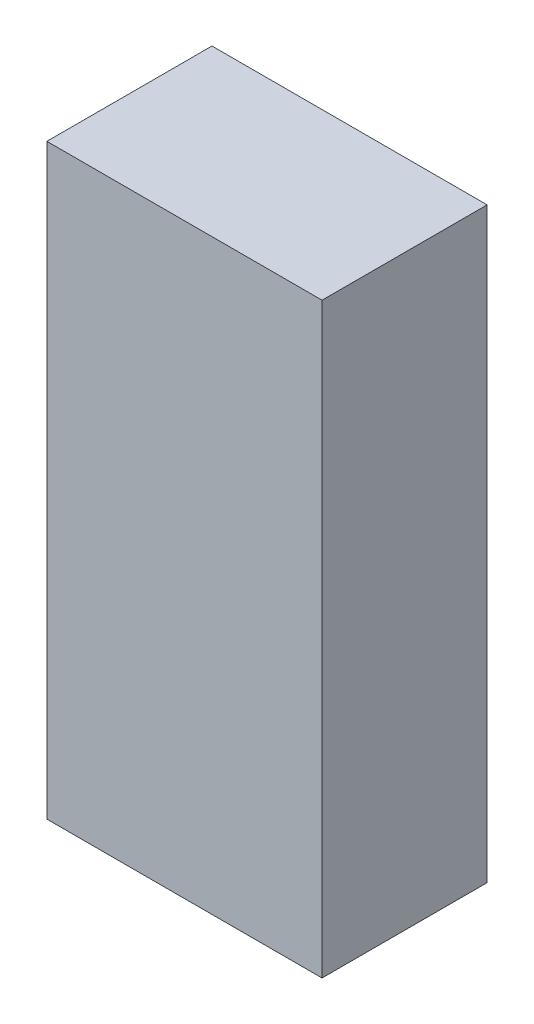
ISO-10303-21;
HEADER;
FILE_DESCRIPTION(('STEP AP214'),'2;1');
FILE_NAME('part.step','',(''),(''),'','','');
FILE_SCHEMA(('AUTOMOTIVE_DESIGN { 1 0 10303 214 1 1 1 1 }'));
ENDSEC;
DATA;
#1=APPLICATION_CONTEXT('core data for automotive mechanical design processes');
#2=APPLICATION_PROTOCOL_DEFINITION('international standard','automotive_design',2000,#1);
#3=PRODUCT_CONTEXT('',#1,'mechanical');
#4=PRODUCT('Part','Part','',(#3));
#5=PRODUCT_RELATED_PRODUCT_CATEGORY('part','',(#4));
#6=PRODUCT_DEFINITION_FORMATION('','',#4);
#7=PRODUCT_DEFINITION_CONTEXT('part definition',#1,'design');
#8=PRODUCT_DEFINITION('design','',#6,#7);
#9=PRODUCT_DEFINITION_SHAPE('','',#8);
#10=(LENGTH_UNIT() NAMED_UNIT(*) SI_UNIT(.MILLI.,.METRE.));
#11=(NAMED_UNIT(*) PLANE_ANGLE_UNIT() SI_UNIT($,.RADIAN.));
#12=(NAMED_UNIT(*) SI_UNIT($,.STERADIAN.) SOLID_ANGLE_UNIT());
#13=UNCERTAINTY_MEASURE_WITH_UNIT(LENGTH_MEASURE(1.E-05),#10,'distance_accuracy_value','');
#14=(GEOMETRIC_REPRESENTATION_CONTEXT(3) GLOBAL_UNCERTAINTY_ASSIGNED_CONTEXT((#13)) GLOBAL_UNIT_ASSIGNED_CONTEXT((#10,
#11,#12)) REPRESENTATION_CONTEXT('',''));
#15=CARTESIAN_POINT('',(0.,0.,0.));
#16=DIRECTION('',(0.,0.,1.));
#17=DIRECTION('',(1.,0.,0.));
#18=AXIS2_PLACEMENT_3D('',#15,#16,#17);
#19=CARTESIAN_POINT('',(0.75000104,1.59999934,0.90000074));
#20=DIRECTION('',(0.,0.,1.));
#21=DIRECTION('',(1.,0.,0.));
#22=AXIS2_PLACEMENT_3D('',#19,#20,#21);
#23=PLANE('',#22);
#24=DIRECTION('',(1.,0.,0.));
#25=VECTOR('',#24,1.);
#26=CARTESIAN_POINT('',(0.75000104,-1.59999934,0.90000074));
#27=LINE('',#26,#25);
#28=CARTESIAN_POINT('',(0.75000104,-1.59999934,0.90000074));
#29=VERTEX_POINT('',#28);
#30=CARTESIAN_POINT('',(-0.75000104,-1.59999934,0.90000074));
#31=VERTEX_POINT('',#30);
#32=EDGE_CURVE('E53',#29,#31,#27,.F.);
#33=ORIENTED_EDGE('',*,*,#32,.F.);
#34=DIRECTION('',(0.,1.,0.));
#35=VECTOR('',#34,1.);
#36=CARTESIAN_POINT('',(0.75000104,1.59999934,0.90000074));
#37=LINE('',#36,#35);
#38=CARTESIAN_POINT('',(0.75000104,1.59999934,0.90000074));
#39=VERTEX_POINT('',#38);
#40=EDGE_CURVE('E68',#39,#29,#37,.F.);
#41=ORIENTED_EDGE('',*,*,#40,.F.);
#42=DIRECTION('',(1.,0.,0.));
#43=VECTOR('',#42,1.);
#44=CARTESIAN_POINT('',(-0.75000104,1.59999934,0.90000074));
#45=LINE('',#44,#43);
#46=CARTESIAN_POINT('',(-0.75000104,1.59999934,0.90000074));
#47=VERTEX_POINT('',#46);
#48=EDGE_CURVE('E20',#47,#39,#45,.T.);
#49=ORIENTED_EDGE('',*,*,#48,.F.);
#50=DIRECTION('',(0.,1.,0.));
#51=VECTOR('',#50,1.);
#52=CARTESIAN_POINT('',(-0.75000104,-1.59999934,0.90000074));
#53=LINE('',#52,#51);
#54=EDGE_CURVE('E58',#31,#47,#53,.T.);
#55=ORIENTED_EDGE('',*,*,#54,.F.);
#56=EDGE_LOOP('',(#33,#41,#49,#55));
#57=FACE_BOUND('',#56,.T.);
#58=ADVANCED_FACE('F17',(#57),#23,.T.);
#59=CARTESIAN_POINT('',(-0.75000104,1.59999934,0.));
#60=DIRECTION('',(0.,1.,0.));
#61=DIRECTION('',(0.,0.,1.));
#62=AXIS2_PLACEMENT_3D('',#59,#60,#61);
#63=PLANE('',#62);
#64=DIRECTION('',(0.,0.,-1.));
#65=VECTOR('',#64,1.);
#66=CARTESIAN_POINT('',(0.75000104,1.59999934,0.));
#67=LINE('',#66,#65);
#68=CARTESIAN_POINT('',(0.75000104,1.59999934,0.));
#69=VERTEX_POINT('',#68);
#70=EDGE_CURVE('E79',#69,#39,#67,.F.);
#71=ORIENTED_EDGE('',*,*,#70,.F.);
#72=DIRECTION('',(1.,0.,0.));
#73=VECTOR('',#72,1.);
#74=CARTESIAN_POINT('',(0.75000104,1.59999934,0.));
#75=LINE('',#74,#73);
#76=CARTESIAN_POINT('',(-0.75000104,1.59999934,0.));
#77=VERTEX_POINT('',#76);
#78=EDGE_CURVE('E74',#69,#77,#75,.F.);
#79=ORIENTED_EDGE('',*,*,#78,.T.);
#80=DIRECTION('',(0.,0.,1.));
#81=VECTOR('',#80,1.);
#82=CARTESIAN_POINT('',(-0.75000104,1.59999934,0.));
#83=LINE('',#82,#81);
#84=EDGE_CURVE('E63',#47,#77,#83,.F.);
#85=ORIENTED_EDGE('',*,*,#84,.F.);
#86=ORIENTED_EDGE('',*,*,#48,.T.);
#87=EDGE_LOOP('',(#71,#79,#85,#86));
#88=FACE_BOUND('',#87,.T.);
#89=ADVANCED_FACE('F73',(#88),#63,.T.);
#90=CARTESIAN_POINT('',(-0.75000104,-1.59999934,0.));
#91=DIRECTION('',(-1.,0.,0.));
#92=DIRECTION('',(0.,0.,1.));
#93=AXIS2_PLACEMENT_3D('',#90,#91,#92);
#94=PLANE('',#93);
#95=ORIENTED_EDGE('',*,*,#84,.T.);
#96=DIRECTION('',(0.,1.,0.));
#97=VECTOR('',#96,1.);
#98=CARTESIAN_POINT('',(-0.75000104,1.59999934,0.));
#99=LINE('',#98,#97);
#100=CARTESIAN_POINT('',(-0.75000104,-1.59999934,0.));
#101=VERTEX_POINT('',#100);
#102=EDGE_CURVE('E84',#77,#101,#99,.F.);
#103=ORIENTED_EDGE('',*,*,#102,.T.);
#104=DIRECTION('',(0.,0.,-1.));
#105=VECTOR('',#104,1.);
#106=CARTESIAN_POINT('',(-0.75000104,-1.59999934,0.));
#107=LINE('',#106,#105);
#108=EDGE_CURVE('E65',#31,#101,#107,.T.);
#109=ORIENTED_EDGE('',*,*,#108,.F.);
#110=ORIENTED_EDGE('',*,*,#54,.T.);
#111=EDGE_LOOP('',(#95,#103,#109,#110));
#112=FACE_BOUND('',#111,.T.);
#113=ADVANCED_FACE('F60',(#112),#94,.T.);
#114=CARTESIAN_POINT('',(0.75000104,-1.59999934,0.));
#115=DIRECTION('',(0.,-1.,0.));
#116=DIRECTION('',(0.,0.,-1.));
#117=AXIS2_PLACEMENT_3D('',#114,#115,#116);
#118=PLANE('',#117);
#119=ORIENTED_EDGE('',*,*,#108,.T.);
#120=DIRECTION('',(1.,0.,0.));
#121=VECTOR('',#120,1.);
#122=CARTESIAN_POINT('',(0.75000104,-1.59999934,0.));
#123=LINE('',#122,#121);
#124=CARTESIAN_POINT('',(0.75000104,-1.59999934,0.));
#125=VERTEX_POINT('',#124);
#126=EDGE_CURVE('E26',#101,#125,#123,.T.);
#127=ORIENTED_EDGE('',*,*,#126,.T.);
#128=DIRECTION('',(0.,0.,-1.));
#129=VECTOR('',#128,1.);
#130=CARTESIAN_POINT('',(0.75000104,-1.59999934,0.));
#131=LINE('',#130,#129);
#132=EDGE_CURVE('E34',#29,#125,#131,.T.);
#133=ORIENTED_EDGE('',*,*,#132,.F.);
#134=ORIENTED_EDGE('',*,*,#32,.T.);
#135=EDGE_LOOP('',(#119,#127,#133,#134));
#136=FACE_BOUND('',#135,.T.);
#137=ADVANCED_FACE('F88',(#136),#118,.T.);
#138=CARTESIAN_POINT('',(0.75000104,1.59999934,0.));
#139=DIRECTION('',(1.,0.,0.));
#140=DIRECTION('',(0.,0.,-1.));
#141=AXIS2_PLACEMENT_3D('',#138,#139,#140);
#142=PLANE('',#141);
#143=ORIENTED_EDGE('',*,*,#132,.T.);
#144=DIRECTION('',(0.,1.,0.));
#145=VECTOR('',#144,1.);
#146=CARTESIAN_POINT('',(0.75000104,1.59999934,0.));
#147=LINE('',#146,#145);
#148=EDGE_CURVE('E11',#125,#69,#147,.T.);
#149=ORIENTED_EDGE('',*,*,#148,.T.);
#150=ORIENTED_EDGE('',*,*,#70,.T.);
#151=ORIENTED_EDGE('',*,*,#40,.T.);
#152=EDGE_LOOP('',(#143,#149,#150,#151));
#153=FACE_BOUND('',#152,.T.);
#154=ADVANCED_FACE('F91',(#153),#142,.T.);
#155=CARTESIAN_POINT('',(0.75000104,1.59999934,0.));
#156=DIRECTION('',(0.,0.,1.));
#157=DIRECTION('',(1.,0.,0.));
#158=AXIS2_PLACEMENT_3D('',#155,#156,#157);
#159=PLANE('',#158);
#160=ORIENTED_EDGE('',*,*,#126,.F.);
#161=ORIENTED_EDGE('',*,*,#102,.F.);
#162=ORIENTED_EDGE('',*,*,#78,.F.);
#163=ORIENTED_EDGE('',*,*,#148,.F.);
#164=EDGE_LOOP('',(#160,#161,#162,#163));
#165=FACE_BOUND('',#164,.T.);
#166=ADVANCED_FACE('F90',(#165),#159,.F.);
#167=CLOSED_SHELL('',(#58,#89,#113,#137,#154,#166));
#168=MANIFOLD_SOLID_BREP('B1',#167);
#169=ADVANCED_BREP_SHAPE_REPRESENTATION('',(#18,#168),#14);
#170=SHAPE_DEFINITION_REPRESENTATION(#9,#169);
ENDSEC;
END-ISO-10303-21;
